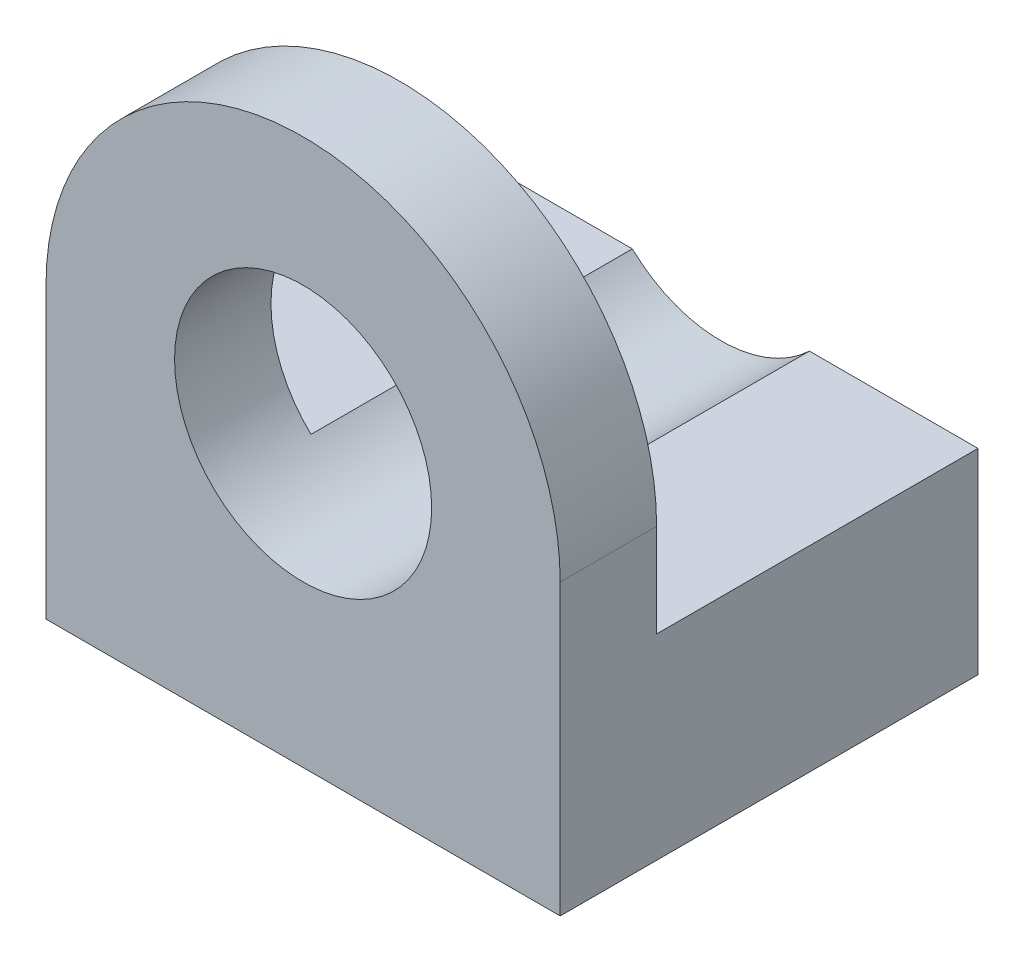
ISO-10303-21;
HEADER;
FILE_DESCRIPTION(('STEP AP214'),'2;1');
FILE_NAME('part.step','',(''),(''),'','','');
FILE_SCHEMA(('AUTOMOTIVE_DESIGN { 1 0 10303 214 1 1 1 1 }'));
ENDSEC;
DATA;
#1=APPLICATION_CONTEXT('core data for automotive mechanical design processes');
#2=APPLICATION_PROTOCOL_DEFINITION('international standard','automotive_design',2000,#1);
#3=PRODUCT_CONTEXT('',#1,'mechanical');
#4=PRODUCT('Part','Part','',(#3));
#5=PRODUCT_RELATED_PRODUCT_CATEGORY('part','',(#4));
#6=PRODUCT_DEFINITION_FORMATION('','',#4);
#7=PRODUCT_DEFINITION_CONTEXT('part definition',#1,'design');
#8=PRODUCT_DEFINITION('design','',#6,#7);
#9=PRODUCT_DEFINITION_SHAPE('','',#8);
#10=(LENGTH_UNIT() NAMED_UNIT(*) SI_UNIT(.MILLI.,.METRE.));
#11=(NAMED_UNIT(*) PLANE_ANGLE_UNIT() SI_UNIT($,.RADIAN.));
#12=(NAMED_UNIT(*) SI_UNIT($,.STERADIAN.) SOLID_ANGLE_UNIT());
#13=UNCERTAINTY_MEASURE_WITH_UNIT(LENGTH_MEASURE(1.E-05),#10,'distance_accuracy_value','');
#14=(GEOMETRIC_REPRESENTATION_CONTEXT(3) GLOBAL_UNCERTAINTY_ASSIGNED_CONTEXT((#13)) GLOBAL_UNIT_ASSIGNED_CONTEXT((#10,
#11,#12)) REPRESENTATION_CONTEXT('',''));
#15=CARTESIAN_POINT('',(0.,0.,0.));
#16=DIRECTION('',(0.,0.,1.));
#17=DIRECTION('',(1.,0.,0.));
#18=AXIS2_PLACEMENT_3D('',#15,#16,#17);
#19=CARTESIAN_POINT('',(0.,0.,0.));
#20=DIRECTION('',(0.,0.,1.));
#21=DIRECTION('',(1.,0.,0.));
#22=AXIS2_PLACEMENT_3D('',#19,#20,#21);
#23=PLANE('',#22);
#24=DIRECTION('',(1.,0.,0.));
#25=VECTOR('',#24,1.);
#26=CARTESIAN_POINT('',(40.,-14.5,0.));
#27=LINE('',#26,#25);
#28=CARTESIAN_POINT('',(13.7749773139559,-14.5,0.));
#29=VERTEX_POINT('',#28);
#30=CARTESIAN_POINT('',(40.,-14.5,0.));
#31=VERTEX_POINT('',#30);
#32=EDGE_CURVE('E124',#29,#31,#27,.T.);
#33=ORIENTED_EDGE('',*,*,#32,.F.);
#34=CARTESIAN_POINT('',(0.,0.,0.));
#35=DIRECTION('',(0.,0.,1.));
#36=DIRECTION('',(1.,0.,0.));
#37=AXIS2_PLACEMENT_3D('',#34,#35,#36);
#38=CIRCLE('',#37,20.);
#39=CARTESIAN_POINT('',(-13.7749773139559,-14.5,0.));
#40=VERTEX_POINT('',#39);
#41=EDGE_CURVE('E146',#29,#40,#38,.T.);
#42=ORIENTED_EDGE('',*,*,#41,.T.);
#43=DIRECTION('',(1.,0.,0.));
#44=VECTOR('',#43,1.);
#45=CARTESIAN_POINT('',(-13.7749773139559,-14.5,0.));
#46=LINE('',#45,#44);
#47=CARTESIAN_POINT('',(-40.,-14.5,0.));
#48=VERTEX_POINT('',#47);
#49=EDGE_CURVE('E50',#48,#40,#46,.T.);
#50=ORIENTED_EDGE('',*,*,#49,.F.);
#51=DIRECTION('',(0.,-1.,0.));
#52=VECTOR('',#51,1.);
#53=CARTESIAN_POINT('',(-40.,0.,0.));
#54=LINE('',#53,#52);
#55=CARTESIAN_POINT('',(-40.,0.,0.));
#56=VERTEX_POINT('',#55);
#57=EDGE_CURVE('E162',#56,#48,#54,.T.);
#58=ORIENTED_EDGE('',*,*,#57,.F.);
#59=CARTESIAN_POINT('',(0.,0.,0.));
#60=DIRECTION('',(0.,0.,1.));
#61=DIRECTION('',(1.,0.,0.));
#62=AXIS2_PLACEMENT_3D('',#59,#60,#61);
#63=CIRCLE('',#62,40.);
#64=CARTESIAN_POINT('',(40.,0.,0.));
#65=VERTEX_POINT('',#64);
#66=EDGE_CURVE('E159',#65,#56,#63,.T.);
#67=ORIENTED_EDGE('',*,*,#66,.F.);
#68=DIRECTION('',(0.,1.,0.));
#69=VECTOR('',#68,1.);
#70=CARTESIAN_POINT('',(40.,0.,0.));
#71=LINE('',#70,#69);
#72=EDGE_CURVE('E57',#31,#65,#71,.T.);
#73=ORIENTED_EDGE('',*,*,#72,.F.);
#74=EDGE_LOOP('',(#33,#42,#50,#58,#67,#73));
#75=FACE_BOUND('',#74,.T.);
#76=ADVANCED_FACE('F35',(#75),#23,.F.);
#77=CARTESIAN_POINT('',(0.,0.,15.));
#78=DIRECTION('',(0.,0.,-1.));
#79=DIRECTION('',(-1.,0.,0.));
#80=AXIS2_PLACEMENT_3D('',#77,#78,#79);
#81=CYLINDRICAL_SURFACE('',#80,40.);
#82=ORIENTED_EDGE('',*,*,#66,.T.);
#83=DIRECTION('',(0.,0.,-1.));
#84=VECTOR('',#83,1.);
#85=CARTESIAN_POINT('',(-40.,0.,15.));
#86=LINE('',#85,#84);
#87=CARTESIAN_POINT('',(-40.,0.,15.));
#88=VERTEX_POINT('',#87);
#89=EDGE_CURVE('E11',#88,#56,#86,.T.);
#90=ORIENTED_EDGE('',*,*,#89,.F.);
#91=CARTESIAN_POINT('',(0.,0.,15.));
#92=DIRECTION('',(0.,0.,1.));
#93=DIRECTION('',(1.,0.,0.));
#94=AXIS2_PLACEMENT_3D('',#91,#92,#93);
#95=CIRCLE('',#94,40.);
#96=CARTESIAN_POINT('',(40.,0.,15.));
#97=VERTEX_POINT('',#96);
#98=EDGE_CURVE('E150',#97,#88,#95,.T.);
#99=ORIENTED_EDGE('',*,*,#98,.F.);
#100=DIRECTION('',(0.,0.,-1.));
#101=VECTOR('',#100,1.);
#102=CARTESIAN_POINT('',(40.,0.,15.));
#103=LINE('',#102,#101);
#104=EDGE_CURVE('E110',#97,#65,#103,.T.);
#105=ORIENTED_EDGE('',*,*,#104,.T.);
#106=EDGE_LOOP('',(#82,#90,#99,#105));
#107=FACE_BOUND('',#106,.T.);
#108=ADVANCED_FACE('F168',(#107),#81,.T.);
#109=CARTESIAN_POINT('',(-40.,0.,15.));
#110=DIRECTION('',(1.,0.,0.));
#111=DIRECTION('',(0.,1.,0.));
#112=AXIS2_PLACEMENT_3D('',#109,#110,#111);
#113=PLANE('',#112);
#114=ORIENTED_EDGE('',*,*,#57,.T.);
#115=DIRECTION('',(0.,0.,1.));
#116=VECTOR('',#115,1.);
#117=CARTESIAN_POINT('',(-40.,-14.5,-50.));
#118=LINE('',#117,#116);
#119=CARTESIAN_POINT('',(-40.,-14.5,-50.));
#120=VERTEX_POINT('',#119);
#121=EDGE_CURVE('E143',#120,#48,#118,.T.);
#122=ORIENTED_EDGE('',*,*,#121,.F.);
#123=DIRECTION('',(0.,1.,0.));
#124=VECTOR('',#123,1.);
#125=CARTESIAN_POINT('',(-40.,-14.5,-50.));
#126=LINE('',#125,#124);
#127=CARTESIAN_POINT('',(-40.,-45.,-50.));
#128=VERTEX_POINT('',#127);
#129=EDGE_CURVE('E118',#128,#120,#126,.T.);
#130=ORIENTED_EDGE('',*,*,#129,.F.);
#131=DIRECTION('',(0.,0.,-1.));
#132=VECTOR('',#131,1.);
#133=CARTESIAN_POINT('',(-40.,-45.,15.));
#134=LINE('',#133,#132);
#135=CARTESIAN_POINT('',(-40.,-45.,15.));
#136=VERTEX_POINT('',#135);
#137=EDGE_CURVE('E43',#136,#128,#134,.T.);
#138=ORIENTED_EDGE('',*,*,#137,.F.);
#139=DIRECTION('',(0.,-1.,0.));
#140=VECTOR('',#139,1.);
#141=CARTESIAN_POINT('',(-40.,0.,15.));
#142=LINE('',#141,#140);
#143=EDGE_CURVE('E153',#88,#136,#142,.T.);
#144=ORIENTED_EDGE('',*,*,#143,.F.);
#145=ORIENTED_EDGE('',*,*,#89,.T.);
#146=EDGE_LOOP('',(#114,#122,#130,#138,#144,#145));
#147=FACE_BOUND('',#146,.T.);
#148=ADVANCED_FACE('F172',(#147),#113,.F.);
#149=CARTESIAN_POINT('',(0.,-45.,15.));
#150=DIRECTION('',(0.,1.,0.));
#151=DIRECTION('',(0.,0.,1.));
#152=AXIS2_PLACEMENT_3D('',#149,#150,#151);
#153=PLANE('',#152);
#154=ORIENTED_EDGE('',*,*,#137,.T.);
#155=DIRECTION('',(-1.,0.,0.));
#156=VECTOR('',#155,1.);
#157=CARTESIAN_POINT('',(-40.,-45.,-50.));
#158=LINE('',#157,#156);
#159=CARTESIAN_POINT('',(40.,-45.,-50.));
#160=VERTEX_POINT('',#159);
#161=EDGE_CURVE('E113',#160,#128,#158,.T.);
#162=ORIENTED_EDGE('',*,*,#161,.F.);
#163=DIRECTION('',(0.,0.,-1.));
#164=VECTOR('',#163,1.);
#165=CARTESIAN_POINT('',(40.,-45.,15.));
#166=LINE('',#165,#164);
#167=CARTESIAN_POINT('',(40.,-45.,15.));
#168=VERTEX_POINT('',#167);
#169=EDGE_CURVE('E100',#168,#160,#166,.T.);
#170=ORIENTED_EDGE('',*,*,#169,.F.);
#171=DIRECTION('',(1.,0.,0.));
#172=VECTOR('',#171,1.);
#173=CARTESIAN_POINT('',(0.,-45.,15.));
#174=LINE('',#173,#172);
#175=EDGE_CURVE('E155',#136,#168,#174,.T.);
#176=ORIENTED_EDGE('',*,*,#175,.F.);
#177=EDGE_LOOP('',(#154,#162,#170,#176));
#178=FACE_BOUND('',#177,.T.);
#179=ADVANCED_FACE('F114',(#178),#153,.F.);
#180=CARTESIAN_POINT('',(0.,0.,15.));
#181=DIRECTION('',(0.,0.,-1.));
#182=DIRECTION('',(-1.,0.,0.));
#183=AXIS2_PLACEMENT_3D('',#180,#181,#182);
#184=CYLINDRICAL_SURFACE('',#183,20.);
#185=CARTESIAN_POINT('',(0.,0.,15.));
#186=DIRECTION('',(0.,0.,1.));
#187=DIRECTION('',(1.,0.,0.));
#188=AXIS2_PLACEMENT_3D('',#185,#186,#187);
#189=CIRCLE('',#188,20.);
#190=CARTESIAN_POINT('',(20.,0.,15.));
#191=VERTEX_POINT('',#190);
#192=EDGE_CURVE('E147',#191,#191,#189,.T.);
#193=ORIENTED_EDGE('',*,*,#192,.T.);
#194=EDGE_LOOP('',(#193));
#195=FACE_BOUND('',#194,.T.);
#196=ORIENTED_EDGE('',*,*,#41,.F.);
#197=DIRECTION('',(0.,0.,1.));
#198=VECTOR('',#197,1.);
#199=CARTESIAN_POINT('',(13.7749773139559,-14.5,-50.));
#200=LINE('',#199,#198);
#201=CARTESIAN_POINT('',(13.7749773139559,-14.5,-50.));
#202=VERTEX_POINT('',#201);
#203=EDGE_CURVE('E137',#202,#29,#200,.T.);
#204=ORIENTED_EDGE('',*,*,#203,.F.);
#205=CARTESIAN_POINT('',(0.,0.,-50.));
#206=DIRECTION('',(0.,0.,1.));
#207=DIRECTION('',(-1.,0.,0.));
#208=AXIS2_PLACEMENT_3D('',#205,#206,#207);
#209=CIRCLE('',#208,20.);
#210=CARTESIAN_POINT('',(-13.7749773139559,-14.5,-50.));
#211=VERTEX_POINT('',#210);
#212=EDGE_CURVE('E131',#211,#202,#209,.T.);
#213=ORIENTED_EDGE('',*,*,#212,.F.);
#214=DIRECTION('',(0.,0.,1.));
#215=VECTOR('',#214,1.);
#216=CARTESIAN_POINT('',(-13.7749773139559,-14.5,-50.));
#217=LINE('',#216,#215);
#218=EDGE_CURVE('E140',#211,#40,#217,.T.);
#219=ORIENTED_EDGE('',*,*,#218,.T.);
#220=EDGE_LOOP('',(#196,#204,#213,#219));
#221=FACE_BOUND('',#220,.T.);
#222=ADVANCED_FACE('F37',(#195,#221),#184,.F.);
#223=CARTESIAN_POINT('',(40.,0.,15.));
#224=DIRECTION('',(-1.,0.,0.));
#225=DIRECTION('',(0.,-1.,0.));
#226=AXIS2_PLACEMENT_3D('',#223,#224,#225);
#227=PLANE('',#226);
#228=ORIENTED_EDGE('',*,*,#169,.T.);
#229=DIRECTION('',(0.,-1.,0.));
#230=VECTOR('',#229,1.);
#231=CARTESIAN_POINT('',(40.,-45.,-50.));
#232=LINE('',#231,#230);
#233=CARTESIAN_POINT('',(40.,-14.5,-50.));
#234=VERTEX_POINT('',#233);
#235=EDGE_CURVE('E105',#234,#160,#232,.T.);
#236=ORIENTED_EDGE('',*,*,#235,.F.);
#237=DIRECTION('',(0.,0.,1.));
#238=VECTOR('',#237,1.);
#239=CARTESIAN_POINT('',(40.,-14.5,-50.));
#240=LINE('',#239,#238);
#241=EDGE_CURVE('E134',#234,#31,#240,.T.);
#242=ORIENTED_EDGE('',*,*,#241,.T.);
#243=ORIENTED_EDGE('',*,*,#72,.T.);
#244=ORIENTED_EDGE('',*,*,#104,.F.);
#245=DIRECTION('',(0.,1.,0.));
#246=VECTOR('',#245,1.);
#247=CARTESIAN_POINT('',(40.,0.,15.));
#248=LINE('',#247,#246);
#249=EDGE_CURVE('E107',#168,#97,#248,.T.);
#250=ORIENTED_EDGE('',*,*,#249,.F.);
#251=EDGE_LOOP('',(#228,#236,#242,#243,#244,#250));
#252=FACE_BOUND('',#251,.T.);
#253=ADVANCED_FACE('F102',(#252),#227,.F.);
#254=CARTESIAN_POINT('',(0.,0.,15.));
#255=DIRECTION('',(0.,0.,1.));
#256=DIRECTION('',(1.,0.,0.));
#257=AXIS2_PLACEMENT_3D('',#254,#255,#256);
#258=PLANE('',#257);
#259=ORIENTED_EDGE('',*,*,#192,.F.);
#260=EDGE_LOOP('',(#259));
#261=FACE_BOUND('',#260,.T.);
#262=ORIENTED_EDGE('',*,*,#98,.T.);
#263=ORIENTED_EDGE('',*,*,#143,.T.);
#264=ORIENTED_EDGE('',*,*,#175,.T.);
#265=ORIENTED_EDGE('',*,*,#249,.T.);
#266=EDGE_LOOP('',(#262,#263,#264,#265));
#267=FACE_BOUND('',#266,.T.);
#268=ADVANCED_FACE('F174',(#261,#267),#258,.T.);
#269=CARTESIAN_POINT('',(-13.7749773139559,-14.5,-50.));
#270=DIRECTION('',(0.,-1.,0.));
#271=DIRECTION('',(1.,0.,0.));
#272=AXIS2_PLACEMENT_3D('',#269,#270,#271);
#273=PLANE('',#272);
#274=ORIENTED_EDGE('',*,*,#49,.T.);
#275=ORIENTED_EDGE('',*,*,#218,.F.);
#276=DIRECTION('',(1.,0.,0.));
#277=VECTOR('',#276,1.);
#278=CARTESIAN_POINT('',(-13.7749773139559,-14.5,-50.));
#279=LINE('',#278,#277);
#280=EDGE_CURVE('E129',#120,#211,#279,.T.);
#281=ORIENTED_EDGE('',*,*,#280,.F.);
#282=ORIENTED_EDGE('',*,*,#121,.T.);
#283=EDGE_LOOP('',(#274,#275,#281,#282));
#284=FACE_BOUND('',#283,.T.);
#285=ADVANCED_FACE('F176',(#284),#273,.F.);
#286=CARTESIAN_POINT('',(40.,-14.5,-50.));
#287=DIRECTION('',(0.,-1.,0.));
#288=DIRECTION('',(1.,0.,0.));
#289=AXIS2_PLACEMENT_3D('',#286,#287,#288);
#290=PLANE('',#289);
#291=ORIENTED_EDGE('',*,*,#32,.T.);
#292=ORIENTED_EDGE('',*,*,#241,.F.);
#293=DIRECTION('',(1.,0.,0.));
#294=VECTOR('',#293,1.);
#295=CARTESIAN_POINT('',(40.,-14.5,-50.));
#296=LINE('',#295,#294);
#297=EDGE_CURVE('E122',#202,#234,#296,.T.);
#298=ORIENTED_EDGE('',*,*,#297,.F.);
#299=ORIENTED_EDGE('',*,*,#203,.T.);
#300=EDGE_LOOP('',(#291,#292,#298,#299));
#301=FACE_BOUND('',#300,.T.);
#302=ADVANCED_FACE('F184',(#301),#290,.F.);
#303=CARTESIAN_POINT('',(0.,0.,-50.));
#304=DIRECTION('',(0.,0.,-1.));
#305=DIRECTION('',(-1.,0.,0.));
#306=AXIS2_PLACEMENT_3D('',#303,#304,#305);
#307=PLANE('',#306);
#308=ORIENTED_EDGE('',*,*,#235,.T.);
#309=ORIENTED_EDGE('',*,*,#161,.T.);
#310=ORIENTED_EDGE('',*,*,#129,.T.);
#311=ORIENTED_EDGE('',*,*,#280,.T.);
#312=ORIENTED_EDGE('',*,*,#212,.T.);
#313=ORIENTED_EDGE('',*,*,#297,.T.);
#314=EDGE_LOOP('',(#308,#309,#310,#311,#312,#313));
#315=FACE_BOUND('',#314,.T.);
#316=ADVANCED_FACE('F120',(#315),#307,.T.);
#317=CLOSED_SHELL('',(#76,#108,#148,#179,#222,#253,#268,#285,#302,#316));
#318=MANIFOLD_SOLID_BREP('B2',#317);
#319=ADVANCED_BREP_SHAPE_REPRESENTATION('',(#18,#318),#14);
#320=SHAPE_DEFINITION_REPRESENTATION(#9,#319);
ENDSEC;
END-ISO-10303-21;
